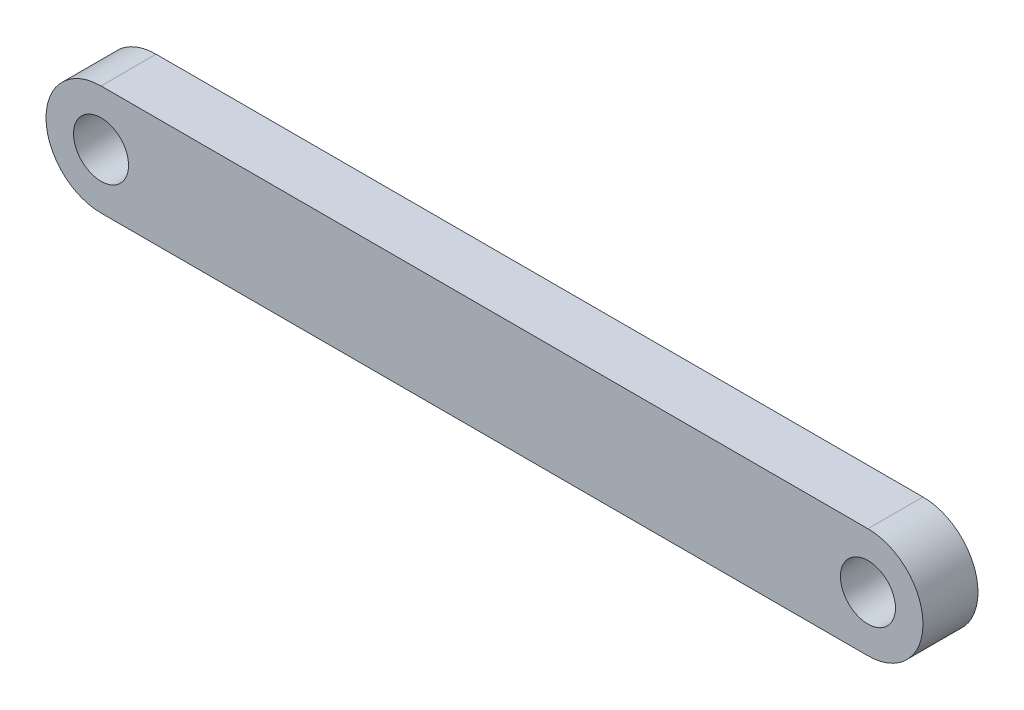
ISO-10303-21;
HEADER;
FILE_DESCRIPTION(('STEP AP214'),'2;1');
FILE_NAME('part.step','',(''),(''),'','','');
FILE_SCHEMA(('AUTOMOTIVE_DESIGN { 1 0 10303 214 1 1 1 1 }'));
ENDSEC;
DATA;
#1=APPLICATION_CONTEXT('core data for automotive mechanical design processes');
#2=APPLICATION_PROTOCOL_DEFINITION('international standard','automotive_design',2000,#1);
#3=PRODUCT_CONTEXT('',#1,'mechanical');
#4=PRODUCT('Part','Part','',(#3));
#5=PRODUCT_RELATED_PRODUCT_CATEGORY('part','',(#4));
#6=PRODUCT_DEFINITION_FORMATION('','',#4);
#7=PRODUCT_DEFINITION_CONTEXT('part definition',#1,'design');
#8=PRODUCT_DEFINITION('design','',#6,#7);
#9=PRODUCT_DEFINITION_SHAPE('','',#8);
#10=(LENGTH_UNIT() NAMED_UNIT(*) SI_UNIT(.MILLI.,.METRE.));
#11=(NAMED_UNIT(*) PLANE_ANGLE_UNIT() SI_UNIT($,.RADIAN.));
#12=(NAMED_UNIT(*) SI_UNIT($,.STERADIAN.) SOLID_ANGLE_UNIT());
#13=UNCERTAINTY_MEASURE_WITH_UNIT(LENGTH_MEASURE(1.E-05),#10,'distance_accuracy_value','');
#14=(GEOMETRIC_REPRESENTATION_CONTEXT(3) GLOBAL_UNCERTAINTY_ASSIGNED_CONTEXT((#13)) GLOBAL_UNIT_ASSIGNED_CONTEXT((#10,
#11,#12)) REPRESENTATION_CONTEXT('',''));
#15=CARTESIAN_POINT('',(0.,0.,0.));
#16=DIRECTION('',(0.,0.,1.));
#17=DIRECTION('',(1.,0.,0.));
#18=AXIS2_PLACEMENT_3D('',#15,#16,#17);
#19=CARTESIAN_POINT('',(34.84,0.,5.));
#20=DIRECTION('',(0.,0.,-1.));
#21=DIRECTION('',(-1.,0.,0.));
#22=AXIS2_PLACEMENT_3D('',#19,#20,#21);
#23=PLANE('',#22);
#24=CARTESIAN_POINT('',(34.84,0.,5.));
#25=DIRECTION('',(0.,0.,1.));
#26=DIRECTION('',(-1.,0.,0.));
#27=AXIS2_PLACEMENT_3D('',#24,#25,#26);
#28=CIRCLE('',#27,5.);
#29=CARTESIAN_POINT('',(34.84,-5.,5.));
#30=VERTEX_POINT('',#29);
#31=CARTESIAN_POINT('',(34.84,5.,5.));
#32=VERTEX_POINT('',#31);
#33=EDGE_CURVE('E92',#30,#32,#28,.T.);
#34=ORIENTED_EDGE('',*,*,#33,.T.);
#35=DIRECTION('',(-1.,0.,0.));
#36=VECTOR('',#35,1.);
#37=CARTESIAN_POINT('',(-34.84,5.,5.));
#38=LINE('',#37,#36);
#39=CARTESIAN_POINT('',(-34.84,5.,5.));
#40=VERTEX_POINT('',#39);
#41=EDGE_CURVE('E87',#32,#40,#38,.T.);
#42=ORIENTED_EDGE('',*,*,#41,.T.);
#43=CARTESIAN_POINT('',(-34.84,0.,5.));
#44=DIRECTION('',(0.,0.,1.));
#45=DIRECTION('',(1.,0.,0.));
#46=AXIS2_PLACEMENT_3D('',#43,#44,#45);
#47=CIRCLE('',#46,5.);
#48=CARTESIAN_POINT('',(-34.84,-5.,5.));
#49=VERTEX_POINT('',#48);
#50=EDGE_CURVE('E90',#40,#49,#47,.T.);
#51=ORIENTED_EDGE('',*,*,#50,.T.);
#52=DIRECTION('',(1.,0.,0.));
#53=VECTOR('',#52,1.);
#54=CARTESIAN_POINT('',(-34.84,-5.,5.));
#55=LINE('',#54,#53);
#56=EDGE_CURVE('E57',#49,#30,#55,.T.);
#57=ORIENTED_EDGE('',*,*,#56,.T.);
#58=EDGE_LOOP('',(#34,#42,#51,#57));
#59=FACE_BOUND('',#58,.T.);
#60=CARTESIAN_POINT('',(-34.84,0.,5.));
#61=DIRECTION('',(0.,0.,1.));
#62=DIRECTION('',(1.,0.,0.));
#63=AXIS2_PLACEMENT_3D('',#60,#61,#62);
#64=CIRCLE('',#63,2.5);
#65=CARTESIAN_POINT('',(-32.34,0.,5.));
#66=VERTEX_POINT('',#65);
#67=EDGE_CURVE('E107',#66,#66,#64,.T.);
#68=ORIENTED_EDGE('',*,*,#67,.F.);
#69=EDGE_LOOP('',(#68));
#70=FACE_BOUND('',#69,.T.);
#71=CARTESIAN_POINT('',(34.84,0.,5.));
#72=DIRECTION('',(0.,0.,1.));
#73=DIRECTION('',(1.,0.,0.));
#74=AXIS2_PLACEMENT_3D('',#71,#72,#73);
#75=CIRCLE('',#74,2.5);
#76=CARTESIAN_POINT('',(37.34,0.,5.));
#77=VERTEX_POINT('',#76);
#78=EDGE_CURVE('E122',#77,#77,#75,.T.);
#79=ORIENTED_EDGE('',*,*,#78,.F.);
#80=EDGE_LOOP('',(#79));
#81=FACE_BOUND('',#80,.T.);
#82=ADVANCED_FACE('F40',(#59,#70,#81),#23,.F.);
#83=CARTESIAN_POINT('',(34.84,0.,0.));
#84=DIRECTION('',(0.,0.,-1.));
#85=DIRECTION('',(-1.,0.,0.));
#86=AXIS2_PLACEMENT_3D('',#83,#84,#85);
#87=PLANE('',#86);
#88=CARTESIAN_POINT('',(-34.84,0.,0.));
#89=DIRECTION('',(0.,0.,1.));
#90=DIRECTION('',(1.,0.,0.));
#91=AXIS2_PLACEMENT_3D('',#88,#89,#90);
#92=CIRCLE('',#91,2.5);
#93=CARTESIAN_POINT('',(-32.34,0.,0.));
#94=VERTEX_POINT('',#93);
#95=EDGE_CURVE('E119',#94,#94,#92,.T.);
#96=ORIENTED_EDGE('',*,*,#95,.T.);
#97=EDGE_LOOP('',(#96));
#98=FACE_BOUND('',#97,.T.);
#99=CARTESIAN_POINT('',(34.84,0.,0.));
#100=DIRECTION('',(0.,0.,1.));
#101=DIRECTION('',(-1.,0.,0.));
#102=AXIS2_PLACEMENT_3D('',#99,#100,#101);
#103=CIRCLE('',#102,5.);
#104=CARTESIAN_POINT('',(34.84,-5.,0.));
#105=VERTEX_POINT('',#104);
#106=CARTESIAN_POINT('',(34.84,5.,0.));
#107=VERTEX_POINT('',#106);
#108=EDGE_CURVE('E104',#105,#107,#103,.T.);
#109=ORIENTED_EDGE('',*,*,#108,.F.);
#110=DIRECTION('',(1.,0.,0.));
#111=VECTOR('',#110,1.);
#112=CARTESIAN_POINT('',(-34.84,-5.,0.));
#113=LINE('',#112,#111);
#114=CARTESIAN_POINT('',(-34.84,-5.,0.));
#115=VERTEX_POINT('',#114);
#116=EDGE_CURVE('E80',#115,#105,#113,.T.);
#117=ORIENTED_EDGE('',*,*,#116,.F.);
#118=CARTESIAN_POINT('',(-34.84,0.,0.));
#119=DIRECTION('',(0.,0.,1.));
#120=DIRECTION('',(1.,0.,0.));
#121=AXIS2_PLACEMENT_3D('',#118,#119,#120);
#122=CIRCLE('',#121,5.);
#123=CARTESIAN_POINT('',(-34.84,5.,0.));
#124=VERTEX_POINT('',#123);
#125=EDGE_CURVE('E74',#124,#115,#122,.T.);
#126=ORIENTED_EDGE('',*,*,#125,.F.);
#127=DIRECTION('',(-1.,0.,0.));
#128=VECTOR('',#127,1.);
#129=CARTESIAN_POINT('',(-34.84,5.,0.));
#130=LINE('',#129,#128);
#131=EDGE_CURVE('E96',#107,#124,#130,.T.);
#132=ORIENTED_EDGE('',*,*,#131,.F.);
#133=EDGE_LOOP('',(#109,#117,#126,#132));
#134=FACE_BOUND('',#133,.T.);
#135=CARTESIAN_POINT('',(34.84,0.,0.));
#136=DIRECTION('',(0.,0.,1.));
#137=DIRECTION('',(1.,0.,0.));
#138=AXIS2_PLACEMENT_3D('',#135,#136,#137);
#139=CIRCLE('',#138,2.5);
#140=CARTESIAN_POINT('',(37.34,0.,0.));
#141=VERTEX_POINT('',#140);
#142=EDGE_CURVE('E125',#141,#141,#139,.T.);
#143=ORIENTED_EDGE('',*,*,#142,.T.);
#144=EDGE_LOOP('',(#143));
#145=FACE_BOUND('',#144,.T.);
#146=ADVANCED_FACE('F115',(#98,#134,#145),#87,.T.);
#147=CARTESIAN_POINT('',(34.84,0.,5.));
#148=DIRECTION('',(0.,0.,-1.));
#149=DIRECTION('',(-1.,0.,0.));
#150=AXIS2_PLACEMENT_3D('',#147,#148,#149);
#151=CYLINDRICAL_SURFACE('',#150,5.);
#152=ORIENTED_EDGE('',*,*,#108,.T.);
#153=DIRECTION('',(0.,0.,-1.));
#154=VECTOR('',#153,1.);
#155=CARTESIAN_POINT('',(34.84,5.,5.));
#156=LINE('',#155,#154);
#157=EDGE_CURVE('E11',#32,#107,#156,.T.);
#158=ORIENTED_EDGE('',*,*,#157,.F.);
#159=ORIENTED_EDGE('',*,*,#33,.F.);
#160=DIRECTION('',(0.,0.,-1.));
#161=VECTOR('',#160,1.);
#162=CARTESIAN_POINT('',(34.84,-5.,5.));
#163=LINE('',#162,#161);
#164=EDGE_CURVE('E100',#30,#105,#163,.T.);
#165=ORIENTED_EDGE('',*,*,#164,.T.);
#166=EDGE_LOOP('',(#152,#158,#159,#165));
#167=FACE_BOUND('',#166,.T.);
#168=ADVANCED_FACE('F42',(#167),#151,.T.);
#169=CARTESIAN_POINT('',(-34.84,5.,5.));
#170=DIRECTION('',(0.,-1.,0.));
#171=DIRECTION('',(0.,0.,-1.));
#172=AXIS2_PLACEMENT_3D('',#169,#170,#171);
#173=PLANE('',#172);
#174=ORIENTED_EDGE('',*,*,#131,.T.);
#175=DIRECTION('',(0.,0.,-1.));
#176=VECTOR('',#175,1.);
#177=CARTESIAN_POINT('',(-34.84,5.,5.));
#178=LINE('',#177,#176);
#179=EDGE_CURVE('E49',#40,#124,#178,.T.);
#180=ORIENTED_EDGE('',*,*,#179,.F.);
#181=ORIENTED_EDGE('',*,*,#41,.F.);
#182=ORIENTED_EDGE('',*,*,#157,.T.);
#183=EDGE_LOOP('',(#174,#180,#181,#182));
#184=FACE_BOUND('',#183,.T.);
#185=ADVANCED_FACE('F95',(#184),#173,.F.);
#186=CARTESIAN_POINT('',(-34.84,0.,5.));
#187=DIRECTION('',(0.,0.,-1.));
#188=DIRECTION('',(-1.,0.,0.));
#189=AXIS2_PLACEMENT_3D('',#186,#187,#188);
#190=CYLINDRICAL_SURFACE('',#189,5.);
#191=ORIENTED_EDGE('',*,*,#125,.T.);
#192=DIRECTION('',(0.,0.,-1.));
#193=VECTOR('',#192,1.);
#194=CARTESIAN_POINT('',(-34.84,-5.,5.));
#195=LINE('',#194,#193);
#196=EDGE_CURVE('E97',#49,#115,#195,.T.);
#197=ORIENTED_EDGE('',*,*,#196,.F.);
#198=ORIENTED_EDGE('',*,*,#50,.F.);
#199=ORIENTED_EDGE('',*,*,#179,.T.);
#200=EDGE_LOOP('',(#191,#197,#198,#199));
#201=FACE_BOUND('',#200,.T.);
#202=ADVANCED_FACE('F98',(#201),#190,.T.);
#203=CARTESIAN_POINT('',(-34.84,-5.,5.));
#204=DIRECTION('',(0.,1.,0.));
#205=DIRECTION('',(0.,0.,1.));
#206=AXIS2_PLACEMENT_3D('',#203,#204,#205);
#207=PLANE('',#206);
#208=ORIENTED_EDGE('',*,*,#116,.T.);
#209=ORIENTED_EDGE('',*,*,#164,.F.);
#210=ORIENTED_EDGE('',*,*,#56,.F.);
#211=ORIENTED_EDGE('',*,*,#196,.T.);
#212=EDGE_LOOP('',(#208,#209,#210,#211));
#213=FACE_BOUND('',#212,.T.);
#214=ADVANCED_FACE('F112',(#213),#207,.F.);
#215=CARTESIAN_POINT('',(-34.84,0.,5.));
#216=DIRECTION('',(0.,0.,-1.));
#217=DIRECTION('',(-1.,0.,0.));
#218=AXIS2_PLACEMENT_3D('',#215,#216,#217);
#219=CYLINDRICAL_SURFACE('',#218,2.5);
#220=ORIENTED_EDGE('',*,*,#67,.T.);
#221=EDGE_LOOP('',(#220));
#222=FACE_BOUND('',#221,.T.);
#223=ORIENTED_EDGE('',*,*,#95,.F.);
#224=EDGE_LOOP('',(#223));
#225=FACE_BOUND('',#224,.T.);
#226=ADVANCED_FACE('F142',(#222,#225),#219,.F.);
#227=CARTESIAN_POINT('',(34.84,0.,5.));
#228=DIRECTION('',(0.,0.,-1.));
#229=DIRECTION('',(-1.,0.,0.));
#230=AXIS2_PLACEMENT_3D('',#227,#228,#229);
#231=CYLINDRICAL_SURFACE('',#230,2.5);
#232=ORIENTED_EDGE('',*,*,#78,.T.);
#233=EDGE_LOOP('',(#232));
#234=FACE_BOUND('',#233,.T.);
#235=ORIENTED_EDGE('',*,*,#142,.F.);
#236=EDGE_LOOP('',(#235));
#237=FACE_BOUND('',#236,.T.);
#238=ADVANCED_FACE('F131',(#234,#237),#231,.F.);
#239=CLOSED_SHELL('',(#82,#146,#168,#185,#202,#214,#226,#238));
#240=MANIFOLD_SOLID_BREP('B2',#239);
#241=ADVANCED_BREP_SHAPE_REPRESENTATION('',(#18,#240),#14);
#242=SHAPE_DEFINITION_REPRESENTATION(#9,#241);
ENDSEC;
END-ISO-10303-21;
